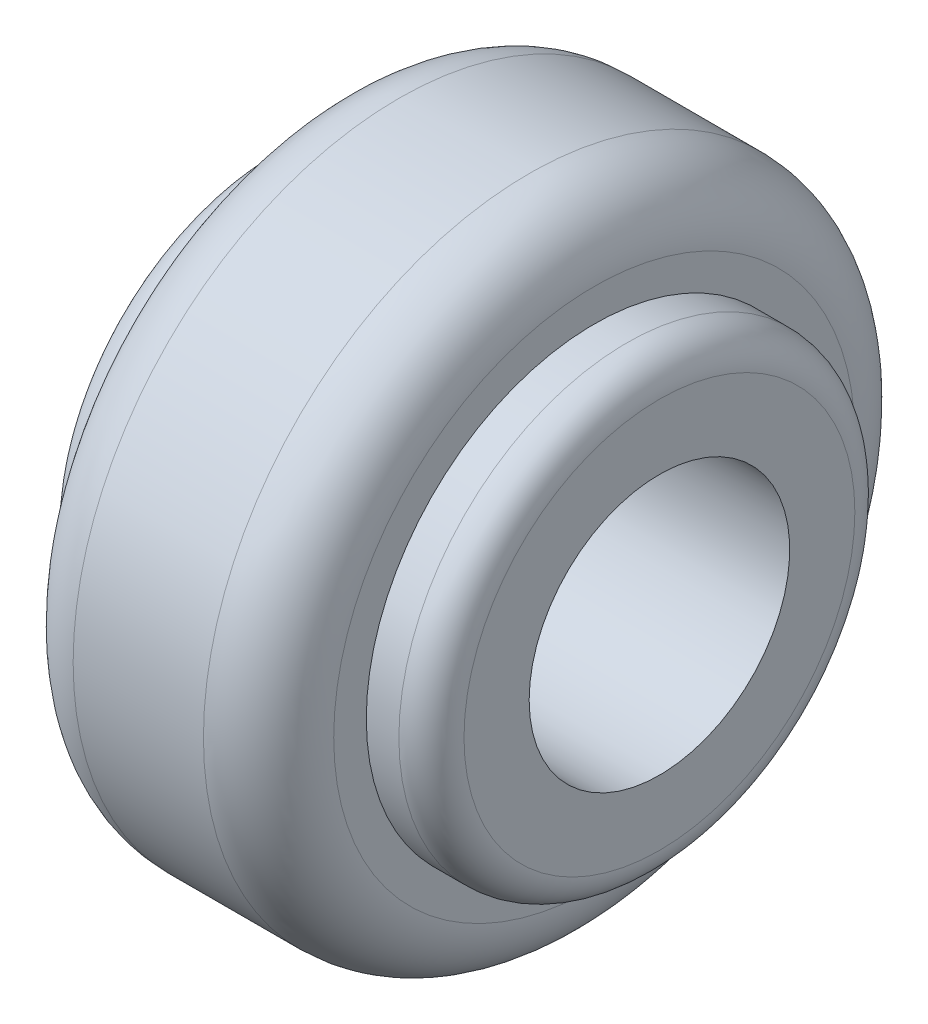
ISO-10303-21;
HEADER;
FILE_DESCRIPTION(('STEP AP214'),'2;1');
FILE_NAME('part.step','',(''),(''),'','','');
FILE_SCHEMA(('AUTOMOTIVE_DESIGN { 1 0 10303 214 1 1 1 1 }'));
ENDSEC;
DATA;
#1=APPLICATION_CONTEXT('core data for automotive mechanical design processes');
#2=APPLICATION_PROTOCOL_DEFINITION('international standard','automotive_design',2000,#1);
#3=PRODUCT_CONTEXT('',#1,'mechanical');
#4=PRODUCT('Part','Part','',(#3));
#5=PRODUCT_RELATED_PRODUCT_CATEGORY('part','',(#4));
#6=PRODUCT_DEFINITION_FORMATION('','',#4);
#7=PRODUCT_DEFINITION_CONTEXT('part definition',#1,'design');
#8=PRODUCT_DEFINITION('design','',#6,#7);
#9=PRODUCT_DEFINITION_SHAPE('','',#8);
#10=(LENGTH_UNIT() NAMED_UNIT(*) SI_UNIT(.MILLI.,.METRE.));
#11=(NAMED_UNIT(*) PLANE_ANGLE_UNIT() SI_UNIT($,.RADIAN.));
#12=(NAMED_UNIT(*) SI_UNIT($,.STERADIAN.) SOLID_ANGLE_UNIT());
#13=UNCERTAINTY_MEASURE_WITH_UNIT(LENGTH_MEASURE(1.E-05),#10,'distance_accuracy_value','');
#14=(GEOMETRIC_REPRESENTATION_CONTEXT(3) GLOBAL_UNCERTAINTY_ASSIGNED_CONTEXT((#13)) GLOBAL_UNIT_ASSIGNED_CONTEXT((#10,
#11,#12)) REPRESENTATION_CONTEXT('',''));
#15=CARTESIAN_POINT('',(0.,0.,0.));
#16=DIRECTION('',(0.,0.,1.));
#17=DIRECTION('',(1.,0.,0.));
#18=AXIS2_PLACEMENT_3D('',#15,#16,#17);
#19=CARTESIAN_POINT('',(0.,0.,-11.1125));
#20=DIRECTION('',(1.,0.,0.));
#21=DIRECTION('',(0.,0.,-1.));
#22=AXIS2_PLACEMENT_3D('',#19,#20,#21);
#23=PLANE('',#22);
#24=CARTESIAN_POINT('',(0.,0.,0.));
#25=DIRECTION('',(1.,0.,0.));
#26=DIRECTION('',(0.,0.,-1.));
#27=AXIS2_PLACEMENT_3D('',#24,#25,#26);
#28=CIRCLE('',#27,9.525);
#29=CARTESIAN_POINT('',(0.,0.,-9.525));
#30=VERTEX_POINT('',#29);
#31=EDGE_CURVE('E46',#30,#30,#28,.F.);
#32=ORIENTED_EDGE('',*,*,#31,.T.);
#33=EDGE_LOOP('',(#32));
#34=FACE_BOUND('',#33,.T.);
#35=CARTESIAN_POINT('',(0.,0.,0.));
#36=DIRECTION('',(-1.,0.,0.));
#37=DIRECTION('',(0.,0.,1.));
#38=AXIS2_PLACEMENT_3D('',#35,#36,#37);
#39=CIRCLE('',#38,6.35);
#40=CARTESIAN_POINT('',(0.,0.,6.35));
#41=VERTEX_POINT('',#40);
#42=EDGE_CURVE('E72',#41,#41,#39,.T.);
#43=ORIENTED_EDGE('',*,*,#42,.F.);
#44=EDGE_LOOP('',(#43));
#45=FACE_BOUND('',#44,.T.);
#46=ADVANCED_FACE('F31',(#34,#45),#23,.F.);
#47=CARTESIAN_POINT('',(0.,0.,0.));
#48=DIRECTION('',(-1.,0.,0.));
#49=DIRECTION('',(0.,0.,1.));
#50=AXIS2_PLACEMENT_3D('',#47,#48,#49);
#51=CYLINDRICAL_SURFACE('',#50,11.1125);
#52=CARTESIAN_POINT('',(1.5875,0.,0.));
#53=DIRECTION('',(1.,0.,0.));
#54=DIRECTION('',(0.,0.,-1.));
#55=AXIS2_PLACEMENT_3D('',#52,#53,#54);
#56=CIRCLE('',#55,11.1125);
#57=CARTESIAN_POINT('',(1.5875,0.,-11.1125));
#58=VERTEX_POINT('',#57);
#59=EDGE_CURVE('E42',#58,#58,#56,.T.);
#60=ORIENTED_EDGE('',*,*,#59,.T.);
#61=EDGE_LOOP('',(#60));
#62=FACE_BOUND('',#61,.T.);
#63=CARTESIAN_POINT('',(3.175,0.,0.));
#64=DIRECTION('',(-1.,0.,0.));
#65=DIRECTION('',(0.,0.,1.));
#66=AXIS2_PLACEMENT_3D('',#63,#64,#65);
#67=CIRCLE('',#66,11.1125);
#68=CARTESIAN_POINT('',(3.175,0.,11.1125));
#69=VERTEX_POINT('',#68);
#70=EDGE_CURVE('E63',#69,#69,#67,.T.);
#71=ORIENTED_EDGE('',*,*,#70,.T.);
#72=EDGE_LOOP('',(#71));
#73=FACE_BOUND('',#72,.T.);
#74=ADVANCED_FACE('F79',(#62,#73),#51,.T.);
#75=CARTESIAN_POINT('',(3.175,0.,-15.875));
#76=DIRECTION('',(1.,0.,0.));
#77=DIRECTION('',(0.,0.,-1.));
#78=AXIS2_PLACEMENT_3D('',#75,#76,#77);
#79=PLANE('',#78);
#80=CARTESIAN_POINT('',(3.175,0.,0.));
#81=DIRECTION('',(1.,0.,0.));
#82=DIRECTION('',(0.,0.,-1.));
#83=AXIS2_PLACEMENT_3D('',#80,#81,#82);
#84=CIRCLE('',#83,12.7);
#85=CARTESIAN_POINT('',(3.175,0.,-12.7));
#86=VERTEX_POINT('',#85);
#87=EDGE_CURVE('E51',#86,#86,#84,.F.);
#88=ORIENTED_EDGE('',*,*,#87,.T.);
#89=EDGE_LOOP('',(#88));
#90=FACE_BOUND('',#89,.T.);
#91=ORIENTED_EDGE('',*,*,#70,.F.);
#92=EDGE_LOOP('',(#91));
#93=FACE_BOUND('',#92,.T.);
#94=ADVANCED_FACE('F85',(#90,#93),#79,.F.);
#95=CARTESIAN_POINT('',(0.,0.,0.));
#96=DIRECTION('',(-1.,0.,0.));
#97=DIRECTION('',(0.,0.,1.));
#98=AXIS2_PLACEMENT_3D('',#95,#96,#97);
#99=CYLINDRICAL_SURFACE('',#98,15.875);
#100=CARTESIAN_POINT('',(12.7,0.,0.));
#101=DIRECTION('',(-1.,0.,0.));
#102=DIRECTION('',(0.,0.,1.));
#103=AXIS2_PLACEMENT_3D('',#100,#101,#102);
#104=CIRCLE('',#103,15.875);
#105=CARTESIAN_POINT('',(12.7,0.,15.875));
#106=VERTEX_POINT('',#105);
#107=EDGE_CURVE('E57',#106,#106,#104,.T.);
#108=ORIENTED_EDGE('',*,*,#107,.T.);
#109=EDGE_LOOP('',(#108));
#110=FACE_BOUND('',#109,.T.);
#111=CARTESIAN_POINT('',(6.35,0.,0.));
#112=DIRECTION('',(1.,0.,0.));
#113=DIRECTION('',(0.,0.,-1.));
#114=AXIS2_PLACEMENT_3D('',#111,#112,#113);
#115=CIRCLE('',#114,15.875);
#116=CARTESIAN_POINT('',(6.35,0.,-15.875));
#117=VERTEX_POINT('',#116);
#118=EDGE_CURVE('E60',#117,#117,#115,.T.);
#119=ORIENTED_EDGE('',*,*,#118,.T.);
#120=EDGE_LOOP('',(#119));
#121=FACE_BOUND('',#120,.T.);
#122=ADVANCED_FACE('F111',(#110,#121),#99,.T.);
#123=CARTESIAN_POINT('',(15.875,0.,-11.1125));
#124=DIRECTION('',(-1.,0.,0.));
#125=DIRECTION('',(0.,0.,1.));
#126=AXIS2_PLACEMENT_3D('',#123,#124,#125);
#127=PLANE('',#126);
#128=CARTESIAN_POINT('',(15.875,0.,0.));
#129=DIRECTION('',(-1.,0.,0.));
#130=DIRECTION('',(0.,0.,1.));
#131=AXIS2_PLACEMENT_3D('',#128,#129,#130);
#132=CIRCLE('',#131,12.7);
#133=CARTESIAN_POINT('',(15.875,0.,12.7));
#134=VERTEX_POINT('',#133);
#135=EDGE_CURVE('E54',#134,#134,#132,.F.);
#136=ORIENTED_EDGE('',*,*,#135,.T.);
#137=EDGE_LOOP('',(#136));
#138=FACE_BOUND('',#137,.T.);
#139=CARTESIAN_POINT('',(15.875,0.,0.));
#140=DIRECTION('',(-1.,0.,0.));
#141=DIRECTION('',(0.,0.,1.));
#142=AXIS2_PLACEMENT_3D('',#139,#140,#141);
#143=CIRCLE('',#142,11.1125);
#144=CARTESIAN_POINT('',(15.875,0.,11.1125));
#145=VERTEX_POINT('',#144);
#146=EDGE_CURVE('E66',#145,#145,#143,.T.);
#147=ORIENTED_EDGE('',*,*,#146,.T.);
#148=EDGE_LOOP('',(#147));
#149=FACE_BOUND('',#148,.T.);
#150=ADVANCED_FACE('F116',(#138,#149),#127,.F.);
#151=CARTESIAN_POINT('',(0.,0.,0.));
#152=DIRECTION('',(-1.,0.,0.));
#153=DIRECTION('',(0.,0.,1.));
#154=AXIS2_PLACEMENT_3D('',#151,#152,#153);
#155=CYLINDRICAL_SURFACE('',#154,11.1125);
#156=CARTESIAN_POINT('',(17.4625,0.,0.));
#157=DIRECTION('',(-1.,0.,0.));
#158=DIRECTION('',(0.,0.,1.));
#159=AXIS2_PLACEMENT_3D('',#156,#157,#158);
#160=CIRCLE('',#159,11.1125);
#161=CARTESIAN_POINT('',(17.4625,0.,11.1125));
#162=VERTEX_POINT('',#161);
#163=EDGE_CURVE('E38',#162,#162,#160,.T.);
#164=ORIENTED_EDGE('',*,*,#163,.T.);
#165=EDGE_LOOP('',(#164));
#166=FACE_BOUND('',#165,.T.);
#167=ORIENTED_EDGE('',*,*,#146,.F.);
#168=EDGE_LOOP('',(#167));
#169=FACE_BOUND('',#168,.T.);
#170=ADVANCED_FACE('F122',(#166,#169),#155,.T.);
#171=CARTESIAN_POINT('',(19.05,0.,-6.35));
#172=DIRECTION('',(-1.,0.,0.));
#173=DIRECTION('',(0.,0.,1.));
#174=AXIS2_PLACEMENT_3D('',#171,#172,#173);
#175=PLANE('',#174);
#176=CARTESIAN_POINT('',(19.05,0.,0.));
#177=DIRECTION('',(-1.,0.,0.));
#178=DIRECTION('',(0.,0.,1.));
#179=AXIS2_PLACEMENT_3D('',#176,#177,#178);
#180=CIRCLE('',#179,9.525);
#181=CARTESIAN_POINT('',(19.05,0.,9.525));
#182=VERTEX_POINT('',#181);
#183=EDGE_CURVE('E10',#182,#182,#180,.F.);
#184=ORIENTED_EDGE('',*,*,#183,.T.);
#185=EDGE_LOOP('',(#184));
#186=FACE_BOUND('',#185,.T.);
#187=CARTESIAN_POINT('',(19.05,0.,0.));
#188=DIRECTION('',(-1.,0.,0.));
#189=DIRECTION('',(0.,0.,1.));
#190=AXIS2_PLACEMENT_3D('',#187,#188,#189);
#191=CIRCLE('',#190,6.35);
#192=CARTESIAN_POINT('',(19.05,0.,6.35));
#193=VERTEX_POINT('',#192);
#194=EDGE_CURVE('E69',#193,#193,#191,.T.);
#195=ORIENTED_EDGE('',*,*,#194,.T.);
#196=EDGE_LOOP('',(#195));
#197=FACE_BOUND('',#196,.T.);
#198=ADVANCED_FACE('F126',(#186,#197),#175,.F.);
#199=CARTESIAN_POINT('',(0.,0.,0.));
#200=DIRECTION('',(-1.,0.,0.));
#201=DIRECTION('',(0.,0.,1.));
#202=AXIS2_PLACEMENT_3D('',#199,#200,#201);
#203=CYLINDRICAL_SURFACE('',#202,6.35);
#204=ORIENTED_EDGE('',*,*,#194,.F.);
#205=EDGE_LOOP('',(#204));
#206=FACE_BOUND('',#205,.T.);
#207=ORIENTED_EDGE('',*,*,#42,.T.);
#208=EDGE_LOOP('',(#207));
#209=FACE_BOUND('',#208,.T.);
#210=ADVANCED_FACE('F76',(#206,#209),#203,.F.);
#211=CARTESIAN_POINT('',(12.7,0.,0.));
#212=DIRECTION('',(-1.,0.,0.));
#213=DIRECTION('',(0.,0.,1.));
#214=AXIS2_PLACEMENT_3D('',#211,#212,#213);
#215=TOROIDAL_SURFACE('',#214,12.7,3.175);
#216=ORIENTED_EDGE('',*,*,#135,.F.);
#217=EDGE_LOOP('',(#216));
#218=FACE_BOUND('',#217,.T.);
#219=ORIENTED_EDGE('',*,*,#107,.F.);
#220=EDGE_LOOP('',(#219));
#221=FACE_BOUND('',#220,.T.);
#222=ADVANCED_FACE('F90',(#218,#221),#215,.T.);
#223=CARTESIAN_POINT('',(6.35,0.,0.));
#224=DIRECTION('',(1.,0.,0.));
#225=DIRECTION('',(0.,0.,-1.));
#226=AXIS2_PLACEMENT_3D('',#223,#224,#225);
#227=TOROIDAL_SURFACE('',#226,12.7,3.175);
#228=ORIENTED_EDGE('',*,*,#118,.F.);
#229=EDGE_LOOP('',(#228));
#230=FACE_BOUND('',#229,.T.);
#231=ORIENTED_EDGE('',*,*,#87,.F.);
#232=EDGE_LOOP('',(#231));
#233=FACE_BOUND('',#232,.T.);
#234=ADVANCED_FACE('F93',(#230,#233),#227,.T.);
#235=CARTESIAN_POINT('',(1.5875,0.,0.));
#236=DIRECTION('',(1.,0.,0.));
#237=DIRECTION('',(0.,0.,-1.));
#238=AXIS2_PLACEMENT_3D('',#235,#236,#237);
#239=TOROIDAL_SURFACE('',#238,9.525,1.5875);
#240=ORIENTED_EDGE('',*,*,#59,.F.);
#241=EDGE_LOOP('',(#240));
#242=FACE_BOUND('',#241,.T.);
#243=ORIENTED_EDGE('',*,*,#31,.F.);
#244=EDGE_LOOP('',(#243));
#245=FACE_BOUND('',#244,.T.);
#246=ADVANCED_FACE('F96',(#242,#245),#239,.T.);
#247=CARTESIAN_POINT('',(17.4625,0.,0.));
#248=DIRECTION('',(-1.,0.,0.));
#249=DIRECTION('',(0.,0.,1.));
#250=AXIS2_PLACEMENT_3D('',#247,#248,#249);
#251=TOROIDAL_SURFACE('',#250,9.525,1.5875);
#252=ORIENTED_EDGE('',*,*,#183,.F.);
#253=EDGE_LOOP('',(#252));
#254=FACE_BOUND('',#253,.T.);
#255=ORIENTED_EDGE('',*,*,#163,.F.);
#256=EDGE_LOOP('',(#255));
#257=FACE_BOUND('',#256,.T.);
#258=ADVANCED_FACE('F33',(#254,#257),#251,.T.);
#259=CLOSED_SHELL('',(#46,#74,#94,#122,#150,#170,#198,#210,#222,#234,#246,#258));
#260=MANIFOLD_SOLID_BREP('B2',#259);
#261=ADVANCED_BREP_SHAPE_REPRESENTATION('',(#18,#260),#14);
#262=SHAPE_DEFINITION_REPRESENTATION(#9,#261);
ENDSEC;
END-ISO-10303-21;
